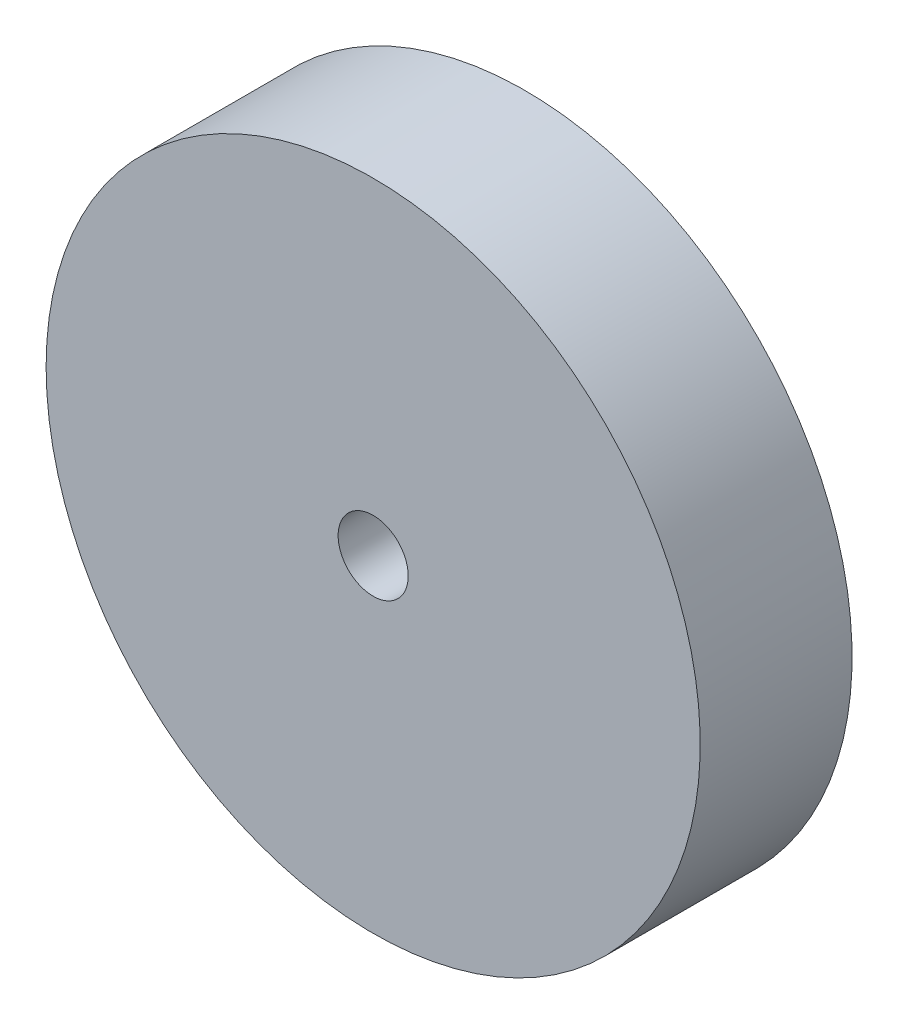
ISO-10303-21;
HEADER;
FILE_DESCRIPTION(('STEP AP214'),'2;1');
FILE_NAME('part.step','',(''),(''),'','','');
FILE_SCHEMA(('AUTOMOTIVE_DESIGN { 1 0 10303 214 1 1 1 1 }'));
ENDSEC;
DATA;
#1=APPLICATION_CONTEXT('core data for automotive mechanical design processes');
#2=APPLICATION_PROTOCOL_DEFINITION('international standard','automotive_design',2000,#1);
#3=PRODUCT_CONTEXT('',#1,'mechanical');
#4=PRODUCT('Part','Part','',(#3));
#5=PRODUCT_RELATED_PRODUCT_CATEGORY('part','',(#4));
#6=PRODUCT_DEFINITION_FORMATION('','',#4);
#7=PRODUCT_DEFINITION_CONTEXT('part definition',#1,'design');
#8=PRODUCT_DEFINITION('design','',#6,#7);
#9=PRODUCT_DEFINITION_SHAPE('','',#8);
#10=(LENGTH_UNIT() NAMED_UNIT(*) SI_UNIT(.MILLI.,.METRE.));
#11=(NAMED_UNIT(*) PLANE_ANGLE_UNIT() SI_UNIT($,.RADIAN.));
#12=(NAMED_UNIT(*) SI_UNIT($,.STERADIAN.) SOLID_ANGLE_UNIT());
#13=UNCERTAINTY_MEASURE_WITH_UNIT(LENGTH_MEASURE(1.E-05),#10,'distance_accuracy_value','');
#14=(GEOMETRIC_REPRESENTATION_CONTEXT(3) GLOBAL_UNCERTAINTY_ASSIGNED_CONTEXT((#13)) GLOBAL_UNIT_ASSIGNED_CONTEXT((#10,
#11,#12)) REPRESENTATION_CONTEXT('',''));
#15=CARTESIAN_POINT('',(0.,0.,0.));
#16=DIRECTION('',(0.,0.,1.));
#17=DIRECTION('',(1.,0.,0.));
#18=AXIS2_PLACEMENT_3D('',#15,#16,#17);
#19=CARTESIAN_POINT('',(0.,0.,13.));
#20=DIRECTION('',(0.,0.,-1.));
#21=DIRECTION('',(-1.,0.,0.));
#22=AXIS2_PLACEMENT_3D('',#19,#20,#21);
#23=CYLINDRICAL_SURFACE('',#22,28.);
#24=CARTESIAN_POINT('',(0.,0.,13.));
#25=DIRECTION('',(0.,0.,1.));
#26=DIRECTION('',(1.,0.,0.));
#27=AXIS2_PLACEMENT_3D('',#24,#25,#26);
#28=CIRCLE('',#27,28.);
#29=CARTESIAN_POINT('',(-28.,0.,13.));
#30=VERTEX_POINT('',#29);
#31=EDGE_CURVE('E10',#30,#30,#28,.T.);
#32=CARTESIAN_POINT('',(0.,0.,0.));
#33=DIRECTION('',(0.,0.,1.));
#34=DIRECTION('',(1.,0.,0.));
#35=AXIS2_PLACEMENT_3D('',#32,#33,#34);
#36=CIRCLE('',#35,28.);
#37=CARTESIAN_POINT('',(-28.,0.,0.));
#38=VERTEX_POINT('',#37);
#39=EDGE_CURVE('E34',#38,#38,#36,.T.);
#40=CARTESIAN_POINT('',(-28.,0.,13.));
#41=CARTESIAN_POINT('',(-28.,0.,12.8645833333333));
#42=CARTESIAN_POINT('',(-28.,0.,12.7291666666667));
#43=CARTESIAN_POINT('',(-28.,0.,12.4583333333333));
#44=CARTESIAN_POINT('',(-28.,0.,12.3229166666667));
#45=CARTESIAN_POINT('',(-28.,0.,12.0520833333333));
#46=CARTESIAN_POINT('',(-28.,0.,11.9166666666667));
#47=CARTESIAN_POINT('',(-28.,0.,11.6458333333333));
#48=CARTESIAN_POINT('',(-28.,0.,11.5104166666667));
#49=CARTESIAN_POINT('',(-28.,0.,11.2395833333333));
#50=CARTESIAN_POINT('',(-28.,0.,11.1041666666667));
#51=CARTESIAN_POINT('',(-28.,0.,10.8333333333333));
#52=CARTESIAN_POINT('',(-28.,0.,10.6979166666667));
#53=CARTESIAN_POINT('',(-28.,0.,10.4270833333333));
#54=CARTESIAN_POINT('',(-28.,0.,10.2916666666667));
#55=CARTESIAN_POINT('',(-28.,0.,10.0208333333333));
#56=CARTESIAN_POINT('',(-28.,0.,9.88541666666667));
#57=CARTESIAN_POINT('',(-28.,0.,9.61458333333333));
#58=CARTESIAN_POINT('',(-28.,0.,9.47916666666667));
#59=CARTESIAN_POINT('',(-28.,0.,9.20833333333333));
#60=CARTESIAN_POINT('',(-28.,0.,9.07291666666667));
#61=CARTESIAN_POINT('',(-28.,0.,8.80208333333333));
#62=CARTESIAN_POINT('',(-28.,0.,8.66666666666667));
#63=CARTESIAN_POINT('',(-28.,0.,8.39583333333333));
#64=CARTESIAN_POINT('',(-28.,0.,8.26041666666667));
#65=CARTESIAN_POINT('',(-28.,0.,7.98958333333333));
#66=CARTESIAN_POINT('',(-28.,0.,7.85416666666667));
#67=CARTESIAN_POINT('',(-28.,0.,7.58333333333333));
#68=CARTESIAN_POINT('',(-28.,0.,7.44791666666667));
#69=CARTESIAN_POINT('',(-28.,0.,7.17708333333333));
#70=CARTESIAN_POINT('',(-28.,0.,7.04166666666667));
#71=CARTESIAN_POINT('',(-28.,0.,6.77083333333333));
#72=CARTESIAN_POINT('',(-28.,0.,6.63541666666667));
#73=CARTESIAN_POINT('',(-28.,0.,6.36458333333333));
#74=CARTESIAN_POINT('',(-28.,0.,6.22916666666667));
#75=CARTESIAN_POINT('',(-28.,0.,5.95833333333333));
#76=CARTESIAN_POINT('',(-28.,0.,5.82291666666667));
#77=CARTESIAN_POINT('',(-28.,0.,5.55208333333333));
#78=CARTESIAN_POINT('',(-28.,0.,5.41666666666667));
#79=CARTESIAN_POINT('',(-28.,0.,5.14583333333333));
#80=CARTESIAN_POINT('',(-28.,0.,5.01041666666667));
#81=CARTESIAN_POINT('',(-28.,0.,4.73958333333333));
#82=CARTESIAN_POINT('',(-28.,0.,4.60416666666667));
#83=CARTESIAN_POINT('',(-28.,0.,4.33333333333333));
#84=CARTESIAN_POINT('',(-28.,0.,4.19791666666667));
#85=CARTESIAN_POINT('',(-28.,0.,3.92708333333333));
#86=CARTESIAN_POINT('',(-28.,0.,3.79166666666667));
#87=CARTESIAN_POINT('',(-28.,0.,3.52083333333333));
#88=CARTESIAN_POINT('',(-28.,0.,3.38541666666667));
#89=CARTESIAN_POINT('',(-28.,0.,3.11458333333333));
#90=CARTESIAN_POINT('',(-28.,0.,2.97916666666667));
#91=CARTESIAN_POINT('',(-28.,0.,2.70833333333333));
#92=CARTESIAN_POINT('',(-28.,0.,2.57291666666667));
#93=CARTESIAN_POINT('',(-28.,0.,2.30208333333333));
#94=CARTESIAN_POINT('',(-28.,0.,2.16666666666667));
#95=CARTESIAN_POINT('',(-28.,0.,1.89583333333333));
#96=CARTESIAN_POINT('',(-28.,0.,1.76041666666667));
#97=CARTESIAN_POINT('',(-28.,0.,1.48958333333333));
#98=CARTESIAN_POINT('',(-28.,0.,1.35416666666667));
#99=CARTESIAN_POINT('',(-28.,0.,1.08333333333333));
#100=CARTESIAN_POINT('',(-28.,0.,0.947916666666667));
#101=CARTESIAN_POINT('',(-28.,0.,0.677083333333334));
#102=CARTESIAN_POINT('',(-28.,0.,0.541666666666667));
#103=CARTESIAN_POINT('',(-28.,0.,0.270833333333334));
#104=CARTESIAN_POINT('',(-28.,0.,0.135416666666667));
#105=CARTESIAN_POINT('',(-28.,0.,0.));
#106=B_SPLINE_CURVE_WITH_KNOTS('',3,(#40,#41,#42,#43,#44,#45,#46,#47,#48,#49,#50,#51,#52,#53,
#54,#55,#56,#57,#58,#59,#60,#61,#62,#63,#64,#65,#66,#67,#68,#69,#70,#71,#72,#73,#74,#75,#76,#77,
#78,#79,#80,#81,#82,#83,#84,#85,#86,#87,#88,#89,#90,#91,#92,#93,#94,#95,#96,#97,#98,#99,#100,
#101,#102,#103,#104,#105),.UNSPECIFIED.,.F.,.F.,(4,2,2,2,2,2,2,2,2,2,2,2,2,2,2,2,2,2,2,2,2,2,2,
2,2,2,2,2,2,2,2,2,4),(0.,0.406249999999999,0.812499999999999,1.21875,1.625,2.03125,2.4375,
2.84375,3.25,3.65625,4.0625,4.46875,4.875,5.28125,5.6875,6.09375,6.5,6.90625,7.3125,7.71875,
8.125,8.53125,8.9375,9.34375,9.75,10.15625,10.5625,10.96875,11.375,11.78125,12.1875,12.59375,
13.),.UNSPECIFIED.);
#107=EDGE_CURVE('BSEAM31',#30,#38,#106,.T.);
#108=ORIENTED_EDGE('',*,*,#31,.F.);
#109=ORIENTED_EDGE('',*,*,#39,.T.);
#110=ORIENTED_EDGE('',*,*,#107,.T.);
#111=ORIENTED_EDGE('',*,*,#107,.F.);
#112=EDGE_LOOP('',(#108,#110,#109,#111));
#113=FACE_BOUND('',#112,.T.);
#114=ADVANCED_FACE('F31',(#113),#23,.T.);
#115=CARTESIAN_POINT('',(0.,0.,13.));
#116=DIRECTION('',(0.,0.,1.));
#117=DIRECTION('',(1.,0.,0.));
#118=AXIS2_PLACEMENT_3D('',#115,#116,#117);
#119=PLANE('',#118);
#120=CARTESIAN_POINT('',(0.,0.,13.));
#121=DIRECTION('',(0.,0.,1.));
#122=DIRECTION('',(1.,0.,0.));
#123=AXIS2_PLACEMENT_3D('',#120,#121,#122);
#124=CIRCLE('',#123,3.);
#125=CARTESIAN_POINT('',(3.,0.,13.));
#126=VERTEX_POINT('',#125);
#127=EDGE_CURVE('E43',#126,#126,#124,.T.);
#128=ORIENTED_EDGE('',*,*,#127,.F.);
#129=EDGE_LOOP('',(#128));
#130=FACE_BOUND('',#129,.T.);
#131=ORIENTED_EDGE('',*,*,#31,.T.);
#132=EDGE_LOOP('',(#131));
#133=FACE_BOUND('',#132,.T.);
#134=ADVANCED_FACE('F58',(#130,#133),#119,.T.);
#135=CARTESIAN_POINT('',(0.,0.,0.));
#136=DIRECTION('',(0.,0.,1.));
#137=DIRECTION('',(1.,0.,0.));
#138=AXIS2_PLACEMENT_3D('',#135,#136,#137);
#139=PLANE('',#138);
#140=CARTESIAN_POINT('',(0.,0.,0.));
#141=DIRECTION('',(0.,0.,1.));
#142=DIRECTION('',(1.,0.,0.));
#143=AXIS2_PLACEMENT_3D('',#140,#141,#142);
#144=CIRCLE('',#143,3.);
#145=CARTESIAN_POINT('',(3.,0.,0.));
#146=VERTEX_POINT('',#145);
#147=EDGE_CURVE('E41',#146,#146,#144,.T.);
#148=ORIENTED_EDGE('',*,*,#147,.T.);
#149=EDGE_LOOP('',(#148));
#150=FACE_BOUND('',#149,.T.);
#151=ORIENTED_EDGE('',*,*,#39,.F.);
#152=EDGE_LOOP('',(#151));
#153=FACE_BOUND('',#152,.T.);
#154=ADVANCED_FACE('F49',(#150,#153),#139,.F.);
#155=CARTESIAN_POINT('',(0.,0.,0.));
#156=DIRECTION('',(0.,0.,1.));
#157=DIRECTION('',(1.,0.,0.));
#158=AXIS2_PLACEMENT_3D('',#155,#156,#157);
#159=CYLINDRICAL_SURFACE('',#158,3.);
#160=CARTESIAN_POINT('',(3.,0.,0.));
#161=CARTESIAN_POINT('',(3.,0.,0.135416666666666));
#162=CARTESIAN_POINT('',(3.,0.,0.270833333333333));
#163=CARTESIAN_POINT('',(3.,0.,0.541666666666667));
#164=CARTESIAN_POINT('',(3.,0.,0.677083333333333));
#165=CARTESIAN_POINT('',(3.,0.,0.947916666666667));
#166=CARTESIAN_POINT('',(3.,0.,1.08333333333333));
#167=CARTESIAN_POINT('',(3.,0.,1.35416666666667));
#168=CARTESIAN_POINT('',(3.,0.,1.48958333333333));
#169=CARTESIAN_POINT('',(3.,0.,1.76041666666667));
#170=CARTESIAN_POINT('',(3.,0.,1.89583333333333));
#171=CARTESIAN_POINT('',(3.,0.,2.16666666666667));
#172=CARTESIAN_POINT('',(3.,0.,2.30208333333333));
#173=CARTESIAN_POINT('',(3.,0.,2.57291666666667));
#174=CARTESIAN_POINT('',(3.,0.,2.70833333333333));
#175=CARTESIAN_POINT('',(3.,0.,2.97916666666667));
#176=CARTESIAN_POINT('',(3.,0.,3.11458333333333));
#177=CARTESIAN_POINT('',(3.,0.,3.38541666666667));
#178=CARTESIAN_POINT('',(3.,0.,3.52083333333333));
#179=CARTESIAN_POINT('',(3.,0.,3.79166666666667));
#180=CARTESIAN_POINT('',(3.,0.,3.92708333333333));
#181=CARTESIAN_POINT('',(3.,0.,4.19791666666667));
#182=CARTESIAN_POINT('',(3.,0.,4.33333333333333));
#183=CARTESIAN_POINT('',(3.,0.,4.60416666666667));
#184=CARTESIAN_POINT('',(3.,0.,4.73958333333333));
#185=CARTESIAN_POINT('',(3.,0.,5.01041666666667));
#186=CARTESIAN_POINT('',(3.,0.,5.14583333333333));
#187=CARTESIAN_POINT('',(3.,0.,5.41666666666667));
#188=CARTESIAN_POINT('',(3.,0.,5.55208333333333));
#189=CARTESIAN_POINT('',(3.,0.,5.82291666666667));
#190=CARTESIAN_POINT('',(3.,0.,5.95833333333333));
#191=CARTESIAN_POINT('',(3.,0.,6.22916666666667));
#192=CARTESIAN_POINT('',(3.,0.,6.36458333333333));
#193=CARTESIAN_POINT('',(3.,0.,6.63541666666667));
#194=CARTESIAN_POINT('',(3.,0.,6.77083333333333));
#195=CARTESIAN_POINT('',(3.,0.,7.04166666666667));
#196=CARTESIAN_POINT('',(3.,0.,7.17708333333333));
#197=CARTESIAN_POINT('',(3.,0.,7.44791666666667));
#198=CARTESIAN_POINT('',(3.,0.,7.58333333333333));
#199=CARTESIAN_POINT('',(3.,0.,7.85416666666667));
#200=CARTESIAN_POINT('',(3.,0.,7.98958333333333));
#201=CARTESIAN_POINT('',(3.,0.,8.26041666666667));
#202=CARTESIAN_POINT('',(3.,0.,8.39583333333333));
#203=CARTESIAN_POINT('',(3.,0.,8.66666666666667));
#204=CARTESIAN_POINT('',(3.,0.,8.80208333333333));
#205=CARTESIAN_POINT('',(3.,0.,9.07291666666667));
#206=CARTESIAN_POINT('',(3.,0.,9.20833333333333));
#207=CARTESIAN_POINT('',(3.,0.,9.47916666666667));
#208=CARTESIAN_POINT('',(3.,0.,9.61458333333333));
#209=CARTESIAN_POINT('',(3.,0.,9.88541666666667));
#210=CARTESIAN_POINT('',(3.,0.,10.0208333333333));
#211=CARTESIAN_POINT('',(3.,0.,10.2916666666667));
#212=CARTESIAN_POINT('',(3.,0.,10.4270833333333));
#213=CARTESIAN_POINT('',(3.,0.,10.6979166666667));
#214=CARTESIAN_POINT('',(3.,0.,10.8333333333333));
#215=CARTESIAN_POINT('',(3.,0.,11.1041666666667));
#216=CARTESIAN_POINT('',(3.,0.,11.2395833333333));
#217=CARTESIAN_POINT('',(3.,0.,11.5104166666667));
#218=CARTESIAN_POINT('',(3.,0.,11.6458333333333));
#219=CARTESIAN_POINT('',(3.,0.,11.9166666666667));
#220=CARTESIAN_POINT('',(3.,0.,12.0520833333333));
#221=CARTESIAN_POINT('',(3.,0.,12.3229166666667));
#222=CARTESIAN_POINT('',(3.,0.,12.4583333333333));
#223=CARTESIAN_POINT('',(3.,0.,12.7291666666667));
#224=CARTESIAN_POINT('',(3.,0.,12.8645833333333));
#225=CARTESIAN_POINT('',(3.,0.,13.));
#226=B_SPLINE_CURVE_WITH_KNOTS('',3,(#160,#161,#162,#163,#164,#165,#166,#167,#168,#169,#170,
#171,#172,#173,#174,#175,#176,#177,#178,#179,#180,#181,#182,#183,#184,#185,#186,#187,#188,#189,
#190,#191,#192,#193,#194,#195,#196,#197,#198,#199,#200,#201,#202,#203,#204,#205,#206,#207,#208,
#209,#210,#211,#212,#213,#214,#215,#216,#217,#218,#219,#220,#221,#222,#223,#224,#225),
.UNSPECIFIED.,.F.,.F.,(4,2,2,2,2,2,2,2,2,2,2,2,2,2,2,2,2,2,2,2,2,2,2,2,2,2,2,2,2,2,2,2,4),(0.,
0.40625,0.8125,1.21875,1.625,2.03125,2.4375,2.84375,3.25,3.65625,4.0625,4.46875,4.875,5.28125,
5.6875,6.09375,6.5,6.90625,7.3125,7.71875,8.125,8.53125,8.9375,9.34375,9.75,10.15625,10.5625,
10.96875,11.375,11.78125,12.1875,12.59375,13.),.UNSPECIFIED.);
#227=EDGE_CURVE('BSEAM52',#146,#126,#226,.T.);
#228=ORIENTED_EDGE('',*,*,#147,.F.);
#229=ORIENTED_EDGE('',*,*,#127,.T.);
#230=ORIENTED_EDGE('',*,*,#227,.T.);
#231=ORIENTED_EDGE('',*,*,#227,.F.);
#232=EDGE_LOOP('',(#228,#230,#229,#231));
#233=FACE_BOUND('',#232,.T.);
#234=ADVANCED_FACE('F52',(#233),#159,.F.);
#235=CLOSED_SHELL('',(#114,#134,#154,#234));
#236=MANIFOLD_SOLID_BREP('B2',#235);
#237=ADVANCED_BREP_SHAPE_REPRESENTATION('',(#18,#236),#14);
#238=SHAPE_DEFINITION_REPRESENTATION(#9,#237);
ENDSEC;
END-ISO-10303-21;
